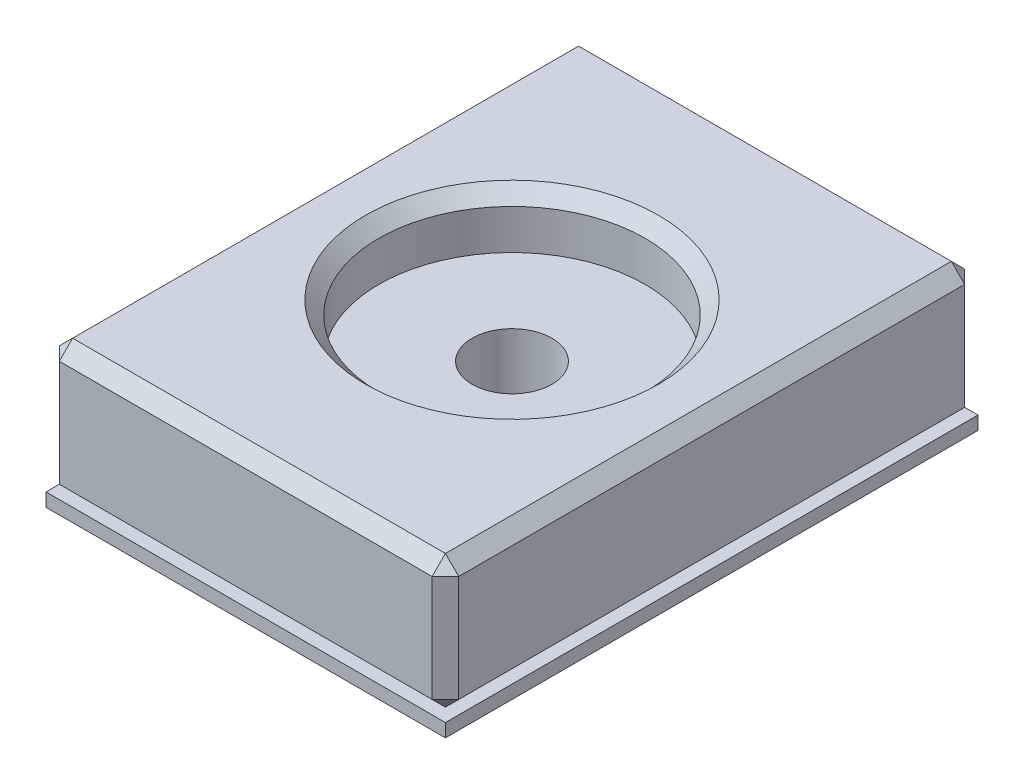
ISO-10303-21;
HEADER;
FILE_DESCRIPTION(('STEP AP214'),'2;1');
FILE_NAME('part.step','',(''),(''),'','','');
FILE_SCHEMA(('AUTOMOTIVE_DESIGN { 1 0 10303 214 1 1 1 1 }'));
ENDSEC;
DATA;
#1=APPLICATION_CONTEXT('core data for automotive mechanical design processes');
#2=APPLICATION_PROTOCOL_DEFINITION('international standard','automotive_design',2000,#1);
#3=PRODUCT_CONTEXT('',#1,'mechanical');
#4=PRODUCT('Part','Part','',(#3));
#5=PRODUCT_RELATED_PRODUCT_CATEGORY('part','',(#4));
#6=PRODUCT_DEFINITION_FORMATION('','',#4);
#7=PRODUCT_DEFINITION_CONTEXT('part definition',#1,'design');
#8=PRODUCT_DEFINITION('design','',#6,#7);
#9=PRODUCT_DEFINITION_SHAPE('','',#8);
#10=(LENGTH_UNIT() NAMED_UNIT(*) SI_UNIT(.MILLI.,.METRE.));
#11=(NAMED_UNIT(*) PLANE_ANGLE_UNIT() SI_UNIT($,.RADIAN.));
#12=(NAMED_UNIT(*) SI_UNIT($,.STERADIAN.) SOLID_ANGLE_UNIT());
#13=UNCERTAINTY_MEASURE_WITH_UNIT(LENGTH_MEASURE(1.E-05),#10,'distance_accuracy_value','');
#14=(GEOMETRIC_REPRESENTATION_CONTEXT(3) GLOBAL_UNCERTAINTY_ASSIGNED_CONTEXT((#13)) GLOBAL_UNIT_ASSIGNED_CONTEXT((#10,
#11,#12)) REPRESENTATION_CONTEXT('',''));
#15=CARTESIAN_POINT('',(0.,0.,0.));
#16=DIRECTION('',(0.,0.,1.));
#17=DIRECTION('',(1.,0.,0.));
#18=AXIS2_PLACEMENT_3D('',#15,#16,#17);
#19=CARTESIAN_POINT('',(0.,-3.,0.));
#20=DIRECTION('',(0.,-1.,0.));
#21=DIRECTION('',(0.,0.,-1.));
#22=AXIS2_PLACEMENT_3D('',#19,#20,#21);
#23=PLANE('',#22);
#24=DIRECTION('',(0.,0.,-1.));
#25=VECTOR('',#24,1.);
#26=CARTESIAN_POINT('',(-7.5,-3.,10.));
#27=LINE('',#26,#25);
#28=CARTESIAN_POINT('',(-7.5,-3.,10.));
#29=VERTEX_POINT('',#28);
#30=CARTESIAN_POINT('',(-7.5,-3.,-10.));
#31=VERTEX_POINT('',#30);
#32=EDGE_CURVE('E103',#29,#31,#27,.T.);
#33=ORIENTED_EDGE('',*,*,#32,.T.);
#34=DIRECTION('',(1.,0.,0.));
#35=VECTOR('',#34,1.);
#36=CARTESIAN_POINT('',(-7.5,-3.,-10.));
#37=LINE('',#36,#35);
#38=CARTESIAN_POINT('',(7.5,-3.,-10.));
#39=VERTEX_POINT('',#38);
#40=EDGE_CURVE('E98',#31,#39,#37,.T.);
#41=ORIENTED_EDGE('',*,*,#40,.T.);
#42=DIRECTION('',(0.,0.,1.));
#43=VECTOR('',#42,1.);
#44=CARTESIAN_POINT('',(7.5,-3.,-10.));
#45=LINE('',#44,#43);
#46=CARTESIAN_POINT('',(7.5,-3.,10.));
#47=VERTEX_POINT('',#46);
#48=EDGE_CURVE('E101',#39,#47,#45,.T.);
#49=ORIENTED_EDGE('',*,*,#48,.T.);
#50=DIRECTION('',(-1.,0.,0.));
#51=VECTOR('',#50,1.);
#52=CARTESIAN_POINT('',(7.5,-3.,10.));
#53=LINE('',#52,#51);
#54=EDGE_CURVE('E68',#47,#29,#53,.T.);
#55=ORIENTED_EDGE('',*,*,#54,.T.);
#56=EDGE_LOOP('',(#33,#41,#49,#55));
#57=FACE_BOUND('',#56,.T.);
#58=CARTESIAN_POINT('',(0.,-3.,0.));
#59=DIRECTION('',(0.,-1.,0.));
#60=DIRECTION('',(0.,0.,-1.));
#61=AXIS2_PLACEMENT_3D('',#58,#59,#60);
#62=CIRCLE('',#61,1.5);
#63=CARTESIAN_POINT('',(0.,-3.,-1.5));
#64=VERTEX_POINT('',#63);
#65=EDGE_CURVE('E118',#64,#64,#62,.T.);
#66=ORIENTED_EDGE('',*,*,#65,.F.);
#67=EDGE_LOOP('',(#66));
#68=FACE_BOUND('',#67,.T.);
#69=ADVANCED_FACE('F51',(#57,#68),#23,.T.);
#70=CARTESIAN_POINT('',(0.,-2.5,0.));
#71=DIRECTION('',(0.,-1.,0.));
#72=DIRECTION('',(0.,0.,-1.));
#73=AXIS2_PLACEMENT_3D('',#70,#71,#72);
#74=PLANE('',#73);
#75=DIRECTION('',(0.,0.,-1.));
#76=VECTOR('',#75,1.);
#77=CARTESIAN_POINT('',(-7.5,-2.5,10.));
#78=LINE('',#77,#76);
#79=CARTESIAN_POINT('',(-7.5,-2.5,10.));
#80=VERTEX_POINT('',#79);
#81=CARTESIAN_POINT('',(-7.5,-2.5,-10.));
#82=VERTEX_POINT('',#81);
#83=EDGE_CURVE('E115',#80,#82,#78,.T.);
#84=ORIENTED_EDGE('',*,*,#83,.F.);
#85=DIRECTION('',(-1.,0.,0.));
#86=VECTOR('',#85,1.);
#87=CARTESIAN_POINT('',(7.5,-2.5,10.));
#88=LINE('',#87,#86);
#89=CARTESIAN_POINT('',(7.5,-2.5,10.));
#90=VERTEX_POINT('',#89);
#91=EDGE_CURVE('E91',#90,#80,#88,.T.);
#92=ORIENTED_EDGE('',*,*,#91,.F.);
#93=DIRECTION('',(0.,0.,1.));
#94=VECTOR('',#93,1.);
#95=CARTESIAN_POINT('',(7.5,-2.5,-10.));
#96=LINE('',#95,#94);
#97=CARTESIAN_POINT('',(7.5,-2.5,-10.));
#98=VERTEX_POINT('',#97);
#99=EDGE_CURVE('E85',#98,#90,#96,.T.);
#100=ORIENTED_EDGE('',*,*,#99,.F.);
#101=DIRECTION('',(1.,0.,0.));
#102=VECTOR('',#101,1.);
#103=CARTESIAN_POINT('',(-7.5,-2.5,-10.));
#104=LINE('',#103,#102);
#105=EDGE_CURVE('E107',#82,#98,#104,.T.);
#106=ORIENTED_EDGE('',*,*,#105,.F.);
#107=EDGE_LOOP('',(#84,#92,#100,#106));
#108=FACE_BOUND('',#107,.T.);
#109=CARTESIAN_POINT('',(0.,-2.5,0.));
#110=DIRECTION('',(0.,-1.,0.));
#111=DIRECTION('',(0.,0.,-1.));
#112=AXIS2_PLACEMENT_3D('',#109,#110,#111);
#113=CIRCLE('',#112,1.5);
#114=CARTESIAN_POINT('',(0.,-2.5,-1.5));
#115=VERTEX_POINT('',#114);
#116=EDGE_CURVE('E130',#115,#115,#113,.T.);
#117=ORIENTED_EDGE('',*,*,#116,.T.);
#118=EDGE_LOOP('',(#117));
#119=FACE_BOUND('',#118,.T.);
#120=ADVANCED_FACE('F126',(#108,#119),#74,.F.);
#121=CARTESIAN_POINT('',(-7.5,-3.,10.));
#122=DIRECTION('',(1.,0.,0.));
#123=DIRECTION('',(0.,0.,-1.));
#124=AXIS2_PLACEMENT_3D('',#121,#122,#123);
#125=PLANE('',#124);
#126=ORIENTED_EDGE('',*,*,#83,.T.);
#127=DIRECTION('',(0.,1.,0.));
#128=VECTOR('',#127,1.);
#129=CARTESIAN_POINT('',(-7.5,-3.,-10.));
#130=LINE('',#129,#128);
#131=EDGE_CURVE('E13',#31,#82,#130,.T.);
#132=ORIENTED_EDGE('',*,*,#131,.F.);
#133=ORIENTED_EDGE('',*,*,#32,.F.);
#134=DIRECTION('',(0.,1.,0.));
#135=VECTOR('',#134,1.);
#136=CARTESIAN_POINT('',(-7.5,-3.,10.));
#137=LINE('',#136,#135);
#138=EDGE_CURVE('E111',#29,#80,#137,.T.);
#139=ORIENTED_EDGE('',*,*,#138,.T.);
#140=EDGE_LOOP('',(#126,#132,#133,#139));
#141=FACE_BOUND('',#140,.T.);
#142=ADVANCED_FACE('F53',(#141),#125,.F.);
#143=CARTESIAN_POINT('',(-7.5,-3.,-10.));
#144=DIRECTION('',(0.,0.,1.));
#145=DIRECTION('',(1.,0.,0.));
#146=AXIS2_PLACEMENT_3D('',#143,#144,#145);
#147=PLANE('',#146);
#148=ORIENTED_EDGE('',*,*,#105,.T.);
#149=DIRECTION('',(0.,1.,0.));
#150=VECTOR('',#149,1.);
#151=CARTESIAN_POINT('',(7.5,-3.,-10.));
#152=LINE('',#151,#150);
#153=EDGE_CURVE('E60',#39,#98,#152,.T.);
#154=ORIENTED_EDGE('',*,*,#153,.F.);
#155=ORIENTED_EDGE('',*,*,#40,.F.);
#156=ORIENTED_EDGE('',*,*,#131,.T.);
#157=EDGE_LOOP('',(#148,#154,#155,#156));
#158=FACE_BOUND('',#157,.T.);
#159=ADVANCED_FACE('F106',(#158),#147,.F.);
#160=CARTESIAN_POINT('',(7.5,-3.,-10.));
#161=DIRECTION('',(-1.,0.,0.));
#162=DIRECTION('',(0.,0.,1.));
#163=AXIS2_PLACEMENT_3D('',#160,#161,#162);
#164=PLANE('',#163);
#165=ORIENTED_EDGE('',*,*,#99,.T.);
#166=DIRECTION('',(0.,1.,0.));
#167=VECTOR('',#166,1.);
#168=CARTESIAN_POINT('',(7.5,-3.,10.));
#169=LINE('',#168,#167);
#170=EDGE_CURVE('E108',#47,#90,#169,.T.);
#171=ORIENTED_EDGE('',*,*,#170,.F.);
#172=ORIENTED_EDGE('',*,*,#48,.F.);
#173=ORIENTED_EDGE('',*,*,#153,.T.);
#174=EDGE_LOOP('',(#165,#171,#172,#173));
#175=FACE_BOUND('',#174,.T.);
#176=ADVANCED_FACE('F109',(#175),#164,.F.);
#177=CARTESIAN_POINT('',(7.5,-3.,10.));
#178=DIRECTION('',(0.,0.,-1.));
#179=DIRECTION('',(-1.,0.,0.));
#180=AXIS2_PLACEMENT_3D('',#177,#178,#179);
#181=PLANE('',#180);
#182=ORIENTED_EDGE('',*,*,#91,.T.);
#183=ORIENTED_EDGE('',*,*,#138,.F.);
#184=ORIENTED_EDGE('',*,*,#54,.F.);
#185=ORIENTED_EDGE('',*,*,#170,.T.);
#186=EDGE_LOOP('',(#182,#183,#184,#185));
#187=FACE_BOUND('',#186,.T.);
#188=ADVANCED_FACE('F123',(#187),#181,.F.);
#189=CARTESIAN_POINT('',(0.,-3.,0.));
#190=DIRECTION('',(0.,1.,0.));
#191=DIRECTION('',(0.,0.,1.));
#192=AXIS2_PLACEMENT_3D('',#189,#190,#191);
#193=CYLINDRICAL_SURFACE('',#192,1.5);
#194=ORIENTED_EDGE('',*,*,#65,.T.);
#195=EDGE_LOOP('',(#194));
#196=FACE_BOUND('',#195,.T.);
#197=ORIENTED_EDGE('',*,*,#116,.F.);
#198=EDGE_LOOP('',(#197));
#199=FACE_BOUND('',#198,.T.);
#200=ADVANCED_FACE('F136',(#196,#199),#193,.F.);
#201=CLOSED_SHELL('',(#69,#120,#142,#159,#176,#188,#200));
#202=MANIFOLD_SOLID_BREP('B2',#201);
#203=CARTESIAN_POINT('',(0.,-2.5,0.));
#204=DIRECTION('',(0.,1.,0.));
#205=DIRECTION('',(0.,0.,1.));
#206=AXIS2_PLACEMENT_3D('',#203,#204,#205);
#207=CYLINDRICAL_SURFACE('',#206,1.5);
#208=CARTESIAN_POINT('',(0.,-2.5,0.));
#209=DIRECTION('',(0.,1.,0.));
#210=DIRECTION('',(0.,0.,1.));
#211=AXIS2_PLACEMENT_3D('',#208,#209,#210);
#212=CIRCLE('',#211,1.5);
#213=CARTESIAN_POINT('',(0.,-2.5,1.5));
#214=VERTEX_POINT('',#213);
#215=EDGE_CURVE('E323',#214,#214,#212,.T.);
#216=ORIENTED_EDGE('',*,*,#215,.F.);
#217=EDGE_LOOP('',(#216));
#218=FACE_BOUND('',#217,.T.);
#219=CARTESIAN_POINT('',(0.,0.500000000000002,0.));
#220=DIRECTION('',(0.,1.,0.));
#221=DIRECTION('',(0.,0.,1.));
#222=AXIS2_PLACEMENT_3D('',#219,#220,#221);
#223=CIRCLE('',#222,1.5);
#224=CARTESIAN_POINT('',(0.,0.500000000000002,1.5));
#225=VERTEX_POINT('',#224);
#226=EDGE_CURVE('E326',#225,#225,#223,.F.);
#227=ORIENTED_EDGE('',*,*,#226,.F.);
#228=EDGE_LOOP('',(#227));
#229=FACE_BOUND('',#228,.T.);
#230=ADVANCED_FACE('F195',(#218,#229),#207,.F.);
#231=CARTESIAN_POINT('',(7.5,-2.5,10.));
#232=DIRECTION('',(-1.,0.,0.));
#233=DIRECTION('',(0.,0.,1.));
#234=AXIS2_PLACEMENT_3D('',#231,#232,#233);
#235=PLANE('',#234);
#236=DIRECTION('',(0.,-1.,0.));
#237=VECTOR('',#236,1.);
#238=CARTESIAN_POINT('',(7.5,-2.5,9.5));
#239=LINE('',#238,#237);
#240=CARTESIAN_POINT('',(7.5,2.,9.5));
#241=VERTEX_POINT('',#240);
#242=CARTESIAN_POINT('',(7.5,-2.,9.5));
#243=VERTEX_POINT('',#242);
#244=EDGE_CURVE('E353',#241,#243,#239,.T.);
#245=ORIENTED_EDGE('',*,*,#244,.T.);
#246=DIRECTION('',(0.,0.,-1.));
#247=VECTOR('',#246,1.);
#248=CARTESIAN_POINT('',(7.5,-2.,10.));
#249=LINE('',#248,#247);
#250=CARTESIAN_POINT('',(7.5,-2.,-9.5));
#251=VERTEX_POINT('',#250);
#252=EDGE_CURVE('E304',#243,#251,#249,.T.);
#253=ORIENTED_EDGE('',*,*,#252,.T.);
#254=DIRECTION('',(0.,1.,0.));
#255=VECTOR('',#254,1.);
#256=CARTESIAN_POINT('',(7.5,2.5,-9.5));
#257=LINE('',#256,#255);
#258=CARTESIAN_POINT('',(7.5,2.,-9.5));
#259=VERTEX_POINT('',#258);
#260=EDGE_CURVE('E355',#251,#259,#257,.T.);
#261=ORIENTED_EDGE('',*,*,#260,.T.);
#262=DIRECTION('',(0.,0.,1.));
#263=VECTOR('',#262,1.);
#264=CARTESIAN_POINT('',(7.5,2.,10.));
#265=LINE('',#264,#263);
#266=EDGE_CURVE('E351',#259,#241,#265,.T.);
#267=ORIENTED_EDGE('',*,*,#266,.T.);
#268=EDGE_LOOP('',(#245,#253,#261,#267));
#269=FACE_BOUND('',#268,.T.);
#270=ADVANCED_FACE('F444',(#269),#235,.F.);
#271=CARTESIAN_POINT('',(-7.5,2.5,10.));
#272=DIRECTION('',(0.,-1.,0.));
#273=DIRECTION('',(0.,0.,-1.));
#274=AXIS2_PLACEMENT_3D('',#271,#272,#273);
#275=PLANE('',#274);
#276=DIRECTION('',(1.,0.,0.));
#277=VECTOR('',#276,1.);
#278=CARTESIAN_POINT('',(-7.5,2.5,9.5));
#279=LINE('',#278,#277);
#280=CARTESIAN_POINT('',(-7.,2.5,9.5));
#281=VERTEX_POINT('',#280);
#282=CARTESIAN_POINT('',(7.,2.5,9.5));
#283=VERTEX_POINT('',#282);
#284=EDGE_CURVE('E212',#281,#283,#279,.T.);
#285=ORIENTED_EDGE('',*,*,#284,.T.);
#286=DIRECTION('',(0.,0.,-1.));
#287=VECTOR('',#286,1.);
#288=CARTESIAN_POINT('',(7.,2.5,10.));
#289=LINE('',#288,#287);
#290=CARTESIAN_POINT('',(7.,2.5,-9.5));
#291=VERTEX_POINT('',#290);
#292=EDGE_CURVE('E204',#283,#291,#289,.T.);
#293=ORIENTED_EDGE('',*,*,#292,.T.);
#294=DIRECTION('',(-1.,0.,0.));
#295=VECTOR('',#294,1.);
#296=CARTESIAN_POINT('',(-7.5,2.5,-9.5));
#297=LINE('',#296,#295);
#298=CARTESIAN_POINT('',(-7.,2.5,-9.5));
#299=VERTEX_POINT('',#298);
#300=EDGE_CURVE('E370',#291,#299,#297,.T.);
#301=ORIENTED_EDGE('',*,*,#300,.T.);
#302=DIRECTION('',(0.,0.,1.));
#303=VECTOR('',#302,1.);
#304=CARTESIAN_POINT('',(-7.,2.5,10.));
#305=LINE('',#304,#303);
#306=EDGE_CURVE('E217',#299,#281,#305,.T.);
#307=ORIENTED_EDGE('',*,*,#306,.T.);
#308=EDGE_LOOP('',(#285,#293,#301,#307));
#309=FACE_BOUND('',#308,.T.);
#310=CARTESIAN_POINT('',(0.,2.5,0.));
#311=DIRECTION('',(0.,-1.,0.));
#312=DIRECTION('',(0.,0.,-1.));
#313=AXIS2_PLACEMENT_3D('',#310,#311,#312);
#314=CIRCLE('',#313,5.5);
#315=CARTESIAN_POINT('',(0.,2.5,-5.5));
#316=VERTEX_POINT('',#315);
#317=EDGE_CURVE('E367',#316,#316,#314,.T.);
#318=ORIENTED_EDGE('',*,*,#317,.T.);
#319=EDGE_LOOP('',(#318));
#320=FACE_BOUND('',#319,.T.);
#321=ADVANCED_FACE('F450',(#309,#320),#275,.F.);
#322=CARTESIAN_POINT('',(-7.5,-2.5,10.));
#323=DIRECTION('',(1.,0.,0.));
#324=DIRECTION('',(0.,0.,-1.));
#325=AXIS2_PLACEMENT_3D('',#322,#323,#324);
#326=PLANE('',#325);
#327=DIRECTION('',(0.,-1.,0.));
#328=VECTOR('',#327,1.);
#329=CARTESIAN_POINT('',(-7.5,-2.5,-9.5));
#330=LINE('',#329,#328);
#331=CARTESIAN_POINT('',(-7.5,2.,-9.5));
#332=VERTEX_POINT('',#331);
#333=CARTESIAN_POINT('',(-7.5,-2.,-9.5));
#334=VERTEX_POINT('',#333);
#335=EDGE_CURVE('E337',#332,#334,#330,.T.);
#336=ORIENTED_EDGE('',*,*,#335,.T.);
#337=DIRECTION('',(0.,0.,1.));
#338=VECTOR('',#337,1.);
#339=CARTESIAN_POINT('',(-7.5,-2.,10.));
#340=LINE('',#339,#338);
#341=CARTESIAN_POINT('',(-7.5,-2.,9.5));
#342=VERTEX_POINT('',#341);
#343=EDGE_CURVE('E339',#334,#342,#340,.T.);
#344=ORIENTED_EDGE('',*,*,#343,.T.);
#345=DIRECTION('',(0.,1.,0.));
#346=VECTOR('',#345,1.);
#347=CARTESIAN_POINT('',(-7.5,-2.5,9.5));
#348=LINE('',#347,#346);
#349=CARTESIAN_POINT('',(-7.5,2.,9.5));
#350=VERTEX_POINT('',#349);
#351=EDGE_CURVE('E335',#342,#350,#348,.T.);
#352=ORIENTED_EDGE('',*,*,#351,.T.);
#353=DIRECTION('',(0.,0.,-1.));
#354=VECTOR('',#353,1.);
#355=CARTESIAN_POINT('',(-7.5,2.,10.));
#356=LINE('',#355,#354);
#357=EDGE_CURVE('E333',#350,#332,#356,.T.);
#358=ORIENTED_EDGE('',*,*,#357,.T.);
#359=EDGE_LOOP('',(#336,#344,#352,#358));
#360=FACE_BOUND('',#359,.T.);
#361=ADVANCED_FACE('F468',(#360),#326,.F.);
#362=CARTESIAN_POINT('',(-7.5,-2.5,10.));
#363=DIRECTION('',(0.,1.,0.));
#364=DIRECTION('',(0.,0.,1.));
#365=AXIS2_PLACEMENT_3D('',#362,#363,#364);
#366=PLANE('',#365);
#367=DIRECTION('',(-1.,0.,0.));
#368=VECTOR('',#367,1.);
#369=CARTESIAN_POINT('',(-7.5,-2.5,9.5));
#370=LINE('',#369,#368);
#371=CARTESIAN_POINT('',(7.,-2.5,9.5));
#372=VERTEX_POINT('',#371);
#373=CARTESIAN_POINT('',(-7.,-2.5,9.5));
#374=VERTEX_POINT('',#373);
#375=EDGE_CURVE('E290',#372,#374,#370,.T.);
#376=ORIENTED_EDGE('',*,*,#375,.T.);
#377=DIRECTION('',(0.,0.,-1.));
#378=VECTOR('',#377,1.);
#379=CARTESIAN_POINT('',(-7.,-2.5,10.));
#380=LINE('',#379,#378);
#381=CARTESIAN_POINT('',(-7.,-2.5,-9.5));
#382=VERTEX_POINT('',#381);
#383=EDGE_CURVE('E331',#374,#382,#380,.T.);
#384=ORIENTED_EDGE('',*,*,#383,.T.);
#385=DIRECTION('',(1.,0.,0.));
#386=VECTOR('',#385,1.);
#387=CARTESIAN_POINT('',(7.5,-2.5,-9.5));
#388=LINE('',#387,#386);
#389=CARTESIAN_POINT('',(7.,-2.5,-9.5));
#390=VERTEX_POINT('',#389);
#391=EDGE_CURVE('E293',#382,#390,#388,.T.);
#392=ORIENTED_EDGE('',*,*,#391,.T.);
#393=DIRECTION('',(0.,0.,1.));
#394=VECTOR('',#393,1.);
#395=CARTESIAN_POINT('',(7.,-2.5,10.));
#396=LINE('',#395,#394);
#397=EDGE_CURVE('E284',#390,#372,#396,.T.);
#398=ORIENTED_EDGE('',*,*,#397,.T.);
#399=EDGE_LOOP('',(#376,#384,#392,#398));
#400=FACE_BOUND('',#399,.T.);
#401=ORIENTED_EDGE('',*,*,#215,.T.);
#402=EDGE_LOOP('',(#401));
#403=FACE_BOUND('',#402,.T.);
#404=ADVANCED_FACE('F286',(#400,#403),#366,.F.);
#405=CARTESIAN_POINT('',(0.,0.,10.));
#406=DIRECTION('',(0.,0.,-1.));
#407=DIRECTION('',(-1.,0.,0.));
#408=AXIS2_PLACEMENT_3D('',#405,#406,#407);
#409=PLANE('',#408);
#410=DIRECTION('',(0.,-1.,0.));
#411=VECTOR('',#410,1.);
#412=CARTESIAN_POINT('',(-7.,0.,10.));
#413=LINE('',#412,#411);
#414=CARTESIAN_POINT('',(-7.,2.,10.));
#415=VERTEX_POINT('',#414);
#416=CARTESIAN_POINT('',(-7.,-2.,10.));
#417=VERTEX_POINT('',#416);
#418=EDGE_CURVE('E362',#415,#417,#413,.T.);
#419=ORIENTED_EDGE('',*,*,#418,.T.);
#420=DIRECTION('',(1.,0.,0.));
#421=VECTOR('',#420,1.);
#422=CARTESIAN_POINT('',(0.,-2.,10.));
#423=LINE('',#422,#421);
#424=CARTESIAN_POINT('',(7.,-2.,10.));
#425=VERTEX_POINT('',#424);
#426=EDGE_CURVE('E364',#417,#425,#423,.T.);
#427=ORIENTED_EDGE('',*,*,#426,.T.);
#428=DIRECTION('',(0.,1.,0.));
#429=VECTOR('',#428,1.);
#430=CARTESIAN_POINT('',(7.,0.,10.));
#431=LINE('',#430,#429);
#432=CARTESIAN_POINT('',(7.,2.,10.));
#433=VERTEX_POINT('',#432);
#434=EDGE_CURVE('E360',#425,#433,#431,.T.);
#435=ORIENTED_EDGE('',*,*,#434,.T.);
#436=DIRECTION('',(-1.,0.,0.));
#437=VECTOR('',#436,1.);
#438=CARTESIAN_POINT('',(0.,2.,10.));
#439=LINE('',#438,#437);
#440=EDGE_CURVE('E358',#433,#415,#439,.T.);
#441=ORIENTED_EDGE('',*,*,#440,.T.);
#442=EDGE_LOOP('',(#419,#427,#435,#441));
#443=FACE_BOUND('',#442,.T.);
#444=ADVANCED_FACE('F458',(#443),#409,.F.);
#445=CARTESIAN_POINT('',(0.,0.,-10.));
#446=DIRECTION('',(0.,0.,-1.));
#447=DIRECTION('',(-1.,0.,0.));
#448=AXIS2_PLACEMENT_3D('',#445,#446,#447);
#449=PLANE('',#448);
#450=DIRECTION('',(-1.,0.,0.));
#451=VECTOR('',#450,1.);
#452=CARTESIAN_POINT('',(-7.5,-2.,-10.));
#453=LINE('',#452,#451);
#454=CARTESIAN_POINT('',(7.,-2.,-10.));
#455=VERTEX_POINT('',#454);
#456=CARTESIAN_POINT('',(-7.,-2.,-10.));
#457=VERTEX_POINT('',#456);
#458=EDGE_CURVE('E346',#455,#457,#453,.T.);
#459=ORIENTED_EDGE('',*,*,#458,.T.);
#460=DIRECTION('',(0.,1.,0.));
#461=VECTOR('',#460,1.);
#462=CARTESIAN_POINT('',(-7.,2.5,-10.));
#463=LINE('',#462,#461);
#464=CARTESIAN_POINT('',(-7.,2.,-10.));
#465=VERTEX_POINT('',#464);
#466=EDGE_CURVE('E348',#457,#465,#463,.T.);
#467=ORIENTED_EDGE('',*,*,#466,.T.);
#468=DIRECTION('',(1.,0.,0.));
#469=VECTOR('',#468,1.);
#470=CARTESIAN_POINT('',(7.5,2.,-10.));
#471=LINE('',#470,#469);
#472=CARTESIAN_POINT('',(7.,2.,-10.));
#473=VERTEX_POINT('',#472);
#474=EDGE_CURVE('E342',#465,#473,#471,.T.);
#475=ORIENTED_EDGE('',*,*,#474,.T.);
#476=DIRECTION('',(0.,-1.,0.));
#477=VECTOR('',#476,1.);
#478=CARTESIAN_POINT('',(7.,-2.5,-10.));
#479=LINE('',#478,#477);
#480=EDGE_CURVE('E344',#473,#455,#479,.T.);
#481=ORIENTED_EDGE('',*,*,#480,.T.);
#482=EDGE_LOOP('',(#459,#467,#475,#481));
#483=FACE_BOUND('',#482,.T.);
#484=ADVANCED_FACE('F461',(#483),#449,.T.);
#485=CARTESIAN_POINT('',(0.,0.500000000000002,0.));
#486=DIRECTION('',(0.,1.,0.));
#487=DIRECTION('',(0.,0.,1.));
#488=AXIS2_PLACEMENT_3D('',#485,#486,#487);
#489=PLANE('',#488);
#490=CARTESIAN_POINT('',(0.,0.500000000000002,0.));
#491=DIRECTION('',(0.,1.,0.));
#492=DIRECTION('',(0.,0.,1.));
#493=AXIS2_PLACEMENT_3D('',#490,#491,#492);
#494=CIRCLE('',#493,5.);
#495=CARTESIAN_POINT('',(0.,0.500000000000002,5.));
#496=VERTEX_POINT('',#495);
#497=EDGE_CURVE('E429',#496,#496,#494,.T.);
#498=ORIENTED_EDGE('',*,*,#497,.T.);
#499=EDGE_LOOP('',(#498));
#500=FACE_BOUND('',#499,.T.);
#501=ORIENTED_EDGE('',*,*,#226,.T.);
#502=EDGE_LOOP('',(#501));
#503=FACE_BOUND('',#502,.T.);
#504=ADVANCED_FACE('F441',(#500,#503),#489,.T.);
#505=CARTESIAN_POINT('',(0.,0.500000000000002,0.));
#506=DIRECTION('',(0.,1.,0.));
#507=DIRECTION('',(0.,0.,1.));
#508=AXIS2_PLACEMENT_3D('',#505,#506,#507);
#509=CYLINDRICAL_SURFACE('',#508,5.);
#510=CARTESIAN_POINT('',(0.,2.,0.));
#511=DIRECTION('',(0.,-1.,0.));
#512=DIRECTION('',(0.,0.,-1.));
#513=AXIS2_PLACEMENT_3D('',#510,#511,#512);
#514=CIRCLE('',#513,5.);
#515=CARTESIAN_POINT('',(0.,2.,-5.));
#516=VERTEX_POINT('',#515);
#517=EDGE_CURVE('E49',#516,#516,#514,.F.);
#518=ORIENTED_EDGE('',*,*,#517,.T.);
#519=EDGE_LOOP('',(#518));
#520=FACE_BOUND('',#519,.T.);
#521=ORIENTED_EDGE('',*,*,#497,.F.);
#522=EDGE_LOOP('',(#521));
#523=FACE_BOUND('',#522,.T.);
#524=ADVANCED_FACE('F456',(#520,#523),#509,.F.);
#525=CARTESIAN_POINT('',(7.,2.5,10.));
#526=DIRECTION('',(-0.707106781186547,-0.707106781186547,0.));
#527=DIRECTION('',(0.,0.,-1.));
#528=AXIS2_PLACEMENT_3D('',#525,#526,#527);
#529=PLANE('',#528);
#530=DIRECTION('',(0.707106781186547,-0.707106781186547,0.));
#531=VECTOR('',#530,1.);
#532=CARTESIAN_POINT('',(7.25,2.25,9.5));
#533=LINE('',#532,#531);
#534=EDGE_CURVE('E199',#241,#283,#533,.F.);
#535=ORIENTED_EDGE('',*,*,#534,.F.);
#536=ORIENTED_EDGE('',*,*,#266,.F.);
#537=DIRECTION('',(-0.707106781186547,0.707106781186547,0.));
#538=VECTOR('',#537,1.);
#539=CARTESIAN_POINT('',(7.5,2.,-9.5));
#540=LINE('',#539,#538);
#541=EDGE_CURVE('E422',#291,#259,#540,.F.);
#542=ORIENTED_EDGE('',*,*,#541,.F.);
#543=ORIENTED_EDGE('',*,*,#292,.F.);
#544=EDGE_LOOP('',(#535,#536,#542,#543));
#545=FACE_BOUND('',#544,.T.);
#546=ADVANCED_FACE('F541',(#545),#529,.F.);
#547=CARTESIAN_POINT('',(7.,2.,10.));
#548=DIRECTION('',(0.577350269189626,0.577350269189626,0.577350269189626));
#549=DIRECTION('',(0.707106781186547,0.,-0.707106781186547));
#550=AXIS2_PLACEMENT_3D('',#547,#548,#549);
#551=PLANE('',#550);
#552=DIRECTION('',(-0.707106781186547,0.,0.707106781186547));
#553=VECTOR('',#552,1.);
#554=CARTESIAN_POINT('',(7.,2.,10.));
#555=LINE('',#554,#553);
#556=EDGE_CURVE('E417',#241,#433,#555,.T.);
#557=ORIENTED_EDGE('',*,*,#556,.F.);
#558=ORIENTED_EDGE('',*,*,#534,.T.);
#559=DIRECTION('',(0.,0.707106781186547,-0.707106781186547));
#560=VECTOR('',#559,1.);
#561=CARTESIAN_POINT('',(7.,2.,10.));
#562=LINE('',#561,#560);
#563=EDGE_CURVE('E420',#433,#283,#562,.T.);
#564=ORIENTED_EDGE('',*,*,#563,.F.);
#565=EDGE_LOOP('',(#557,#558,#564));
#566=FACE_BOUND('',#565,.T.);
#567=ADVANCED_FACE('F539',(#566),#551,.T.);
#568=CARTESIAN_POINT('',(7.5,2.,-9.5));
#569=DIRECTION('',(0.577350269189626,0.577350269189626,-0.577350269189626));
#570=DIRECTION('',(-0.707106781186547,0.,-0.707106781186547));
#571=AXIS2_PLACEMENT_3D('',#568,#569,#570);
#572=PLANE('',#571);
#573=DIRECTION('',(0.,0.707106781186547,0.707106781186547));
#574=VECTOR('',#573,1.);
#575=CARTESIAN_POINT('',(7.,2.25,-9.75));
#576=LINE('',#575,#574);
#577=EDGE_CURVE('E411',#291,#473,#576,.F.);
#578=ORIENTED_EDGE('',*,*,#577,.F.);
#579=ORIENTED_EDGE('',*,*,#541,.T.);
#580=DIRECTION('',(-0.707106781186547,0.,-0.707106781186547));
#581=VECTOR('',#580,1.);
#582=CARTESIAN_POINT('',(7.5,2.,-9.5));
#583=LINE('',#582,#581);
#584=EDGE_CURVE('E414',#473,#259,#583,.F.);
#585=ORIENTED_EDGE('',*,*,#584,.F.);
#586=EDGE_LOOP('',(#578,#579,#585));
#587=FACE_BOUND('',#586,.T.);
#588=ADVANCED_FACE('F535',(#587),#572,.T.);
#589=CARTESIAN_POINT('',(0.,2.,10.));
#590=DIRECTION('',(0.,-0.707106781186547,-0.707106781186547));
#591=DIRECTION('',(-1.,0.,0.));
#592=AXIS2_PLACEMENT_3D('',#589,#590,#591);
#593=PLANE('',#592);
#594=ORIENTED_EDGE('',*,*,#563,.T.);
#595=ORIENTED_EDGE('',*,*,#284,.F.);
#596=DIRECTION('',(0.,-0.707106781186547,0.707106781186547));
#597=VECTOR('',#596,1.);
#598=CARTESIAN_POINT('',(-7.,2.25,9.75));
#599=LINE('',#598,#597);
#600=EDGE_CURVE('E405',#415,#281,#599,.F.);
#601=ORIENTED_EDGE('',*,*,#600,.F.);
#602=ORIENTED_EDGE('',*,*,#440,.F.);
#603=EDGE_LOOP('',(#594,#595,#601,#602));
#604=FACE_BOUND('',#603,.T.);
#605=ADVANCED_FACE('F531',(#604),#593,.F.);
#606=CARTESIAN_POINT('',(7.,0.,10.));
#607=DIRECTION('',(-0.707106781186547,0.,-0.707106781186547));
#608=DIRECTION('',(0.,1.,0.));
#609=AXIS2_PLACEMENT_3D('',#606,#607,#608);
#610=PLANE('',#609);
#611=ORIENTED_EDGE('',*,*,#556,.T.);
#612=ORIENTED_EDGE('',*,*,#434,.F.);
#613=DIRECTION('',(0.707106781186547,0.,-0.707106781186547));
#614=VECTOR('',#613,1.);
#615=CARTESIAN_POINT('',(7.25,-2.,9.75));
#616=LINE('',#615,#614);
#617=EDGE_CURVE('E308',#243,#425,#616,.F.);
#618=ORIENTED_EDGE('',*,*,#617,.F.);
#619=ORIENTED_EDGE('',*,*,#244,.F.);
#620=EDGE_LOOP('',(#611,#612,#618,#619));
#621=FACE_BOUND('',#620,.T.);
#622=ADVANCED_FACE('F528',(#621),#610,.F.);
#623=CARTESIAN_POINT('',(7.5,-2.,10.));
#624=DIRECTION('',(-0.707106781186547,0.707106781186547,0.));
#625=DIRECTION('',(0.,0.,-1.));
#626=AXIS2_PLACEMENT_3D('',#623,#624,#625);
#627=PLANE('',#626);
#628=DIRECTION('',(0.707106781186547,0.707106781186547,0.));
#629=VECTOR('',#628,1.);
#630=CARTESIAN_POINT('',(7.,-2.5,-9.5));
#631=LINE('',#630,#629);
#632=EDGE_CURVE('E309',#251,#390,#631,.F.);
#633=ORIENTED_EDGE('',*,*,#632,.F.);
#634=ORIENTED_EDGE('',*,*,#252,.F.);
#635=DIRECTION('',(-0.707106781186547,-0.707106781186547,0.));
#636=VECTOR('',#635,1.);
#637=CARTESIAN_POINT('',(7.,-2.5,9.5));
#638=LINE('',#637,#636);
#639=EDGE_CURVE('E300',#372,#243,#638,.F.);
#640=ORIENTED_EDGE('',*,*,#639,.F.);
#641=ORIENTED_EDGE('',*,*,#397,.F.);
#642=EDGE_LOOP('',(#633,#634,#640,#641));
#643=FACE_BOUND('',#642,.T.);
#644=ADVANCED_FACE('F302',(#643),#627,.F.);
#645=CARTESIAN_POINT('',(7.5,-2.5,-9.5));
#646=DIRECTION('',(0.707106781186547,0.,-0.707106781186547));
#647=DIRECTION('',(0.,-1.,0.));
#648=AXIS2_PLACEMENT_3D('',#645,#646,#647);
#649=PLANE('',#648);
#650=ORIENTED_EDGE('',*,*,#584,.T.);
#651=ORIENTED_EDGE('',*,*,#260,.F.);
#652=DIRECTION('',(0.707106781186547,0.,0.707106781186547));
#653=VECTOR('',#652,1.);
#654=CARTESIAN_POINT('',(7.25,-2.,-9.75));
#655=LINE('',#654,#653);
#656=EDGE_CURVE('E401',#455,#251,#655,.T.);
#657=ORIENTED_EDGE('',*,*,#656,.F.);
#658=ORIENTED_EDGE('',*,*,#480,.F.);
#659=EDGE_LOOP('',(#650,#651,#657,#658));
#660=FACE_BOUND('',#659,.T.);
#661=ADVANCED_FACE('F521',(#660),#649,.T.);
#662=CARTESIAN_POINT('',(-7.5,2.5,-9.5));
#663=DIRECTION('',(0.,0.707106781186547,-0.707106781186547));
#664=DIRECTION('',(1.,0.,0.));
#665=AXIS2_PLACEMENT_3D('',#662,#663,#664);
#666=PLANE('',#665);
#667=ORIENTED_EDGE('',*,*,#577,.T.);
#668=ORIENTED_EDGE('',*,*,#474,.F.);
#669=DIRECTION('',(0.,-0.707106781186547,-0.707106781186547));
#670=VECTOR('',#669,1.);
#671=CARTESIAN_POINT('',(-7.,2.,-10.));
#672=LINE('',#671,#670);
#673=EDGE_CURVE('E398',#299,#465,#672,.T.);
#674=ORIENTED_EDGE('',*,*,#673,.F.);
#675=ORIENTED_EDGE('',*,*,#300,.F.);
#676=EDGE_LOOP('',(#667,#668,#674,#675));
#677=FACE_BOUND('',#676,.T.);
#678=ADVANCED_FACE('F517',(#677),#666,.T.);
#679=CARTESIAN_POINT('',(-7.5,2.,10.));
#680=DIRECTION('',(0.707106781186547,-0.707106781186547,0.));
#681=DIRECTION('',(0.,0.,-1.));
#682=AXIS2_PLACEMENT_3D('',#679,#680,#681);
#683=PLANE('',#682);
#684=DIRECTION('',(0.707106781186547,0.707106781186547,0.));
#685=VECTOR('',#684,1.);
#686=CARTESIAN_POINT('',(-7.5,2.,9.5));
#687=LINE('',#686,#685);
#688=EDGE_CURVE('E408',#281,#350,#687,.F.);
#689=ORIENTED_EDGE('',*,*,#688,.F.);
#690=ORIENTED_EDGE('',*,*,#306,.F.);
#691=DIRECTION('',(-0.707106781186547,-0.707106781186547,0.));
#692=VECTOR('',#691,1.);
#693=CARTESIAN_POINT('',(-7.25,2.25,-9.5));
#694=LINE('',#693,#692);
#695=EDGE_CURVE('E395',#332,#299,#694,.F.);
#696=ORIENTED_EDGE('',*,*,#695,.F.);
#697=ORIENTED_EDGE('',*,*,#357,.F.);
#698=EDGE_LOOP('',(#689,#690,#696,#697));
#699=FACE_BOUND('',#698,.T.);
#700=ADVANCED_FACE('F513',(#699),#683,.F.);
#701=CARTESIAN_POINT('',(-7.5,2.,9.5));
#702=DIRECTION('',(-0.577350269189626,0.577350269189626,0.577350269189626));
#703=DIRECTION('',(0.707106781186547,0.,0.707106781186547));
#704=AXIS2_PLACEMENT_3D('',#701,#702,#703);
#705=PLANE('',#704);
#706=ORIENTED_EDGE('',*,*,#600,.T.);
#707=ORIENTED_EDGE('',*,*,#688,.T.);
#708=DIRECTION('',(-0.707106781186547,0.,-0.707106781186547));
#709=VECTOR('',#708,1.);
#710=CARTESIAN_POINT('',(-7.5,2.,9.5));
#711=LINE('',#710,#709);
#712=EDGE_CURVE('E316',#415,#350,#711,.T.);
#713=ORIENTED_EDGE('',*,*,#712,.F.);
#714=EDGE_LOOP('',(#706,#707,#713));
#715=FACE_BOUND('',#714,.T.);
#716=ADVANCED_FACE('F510',(#715),#705,.T.);
#717=CARTESIAN_POINT('',(7.,-2.5,9.5));
#718=DIRECTION('',(0.577350269189626,-0.577350269189626,0.577350269189626));
#719=DIRECTION('',(0.707106781186547,0.,-0.707106781186547));
#720=AXIS2_PLACEMENT_3D('',#717,#718,#719);
#721=PLANE('',#720);
#722=ORIENTED_EDGE('',*,*,#639,.T.);
#723=ORIENTED_EDGE('',*,*,#617,.T.);
#724=DIRECTION('',(0.,0.707106781186547,0.707106781186547));
#725=VECTOR('',#724,1.);
#726=CARTESIAN_POINT('',(7.,-2.5,9.5));
#727=LINE('',#726,#725);
#728=EDGE_CURVE('E311',#372,#425,#727,.T.);
#729=ORIENTED_EDGE('',*,*,#728,.F.);
#730=EDGE_LOOP('',(#722,#723,#729));
#731=FACE_BOUND('',#730,.T.);
#732=ADVANCED_FACE('F312',(#731),#721,.T.);
#733=CARTESIAN_POINT('',(7.,-2.5,-9.5));
#734=DIRECTION('',(0.577350269189626,-0.577350269189626,-0.577350269189626));
#735=DIRECTION('',(-0.707106781186547,0.,-0.707106781186547));
#736=AXIS2_PLACEMENT_3D('',#733,#734,#735);
#737=PLANE('',#736);
#738=ORIENTED_EDGE('',*,*,#656,.T.);
#739=ORIENTED_EDGE('',*,*,#632,.T.);
#740=DIRECTION('',(0.,0.707106781186547,-0.707106781186547));
#741=VECTOR('',#740,1.);
#742=CARTESIAN_POINT('',(7.,-2.5,-9.5));
#743=LINE('',#742,#741);
#744=EDGE_CURVE('E317',#455,#390,#743,.F.);
#745=ORIENTED_EDGE('',*,*,#744,.F.);
#746=EDGE_LOOP('',(#738,#739,#745));
#747=FACE_BOUND('',#746,.T.);
#748=ADVANCED_FACE('F503',(#747),#737,.T.);
#749=CARTESIAN_POINT('',(-7.,2.,-10.));
#750=DIRECTION('',(-0.577350269189626,0.577350269189626,-0.577350269189626));
#751=DIRECTION('',(-0.707106781186547,0.,0.707106781186547));
#752=AXIS2_PLACEMENT_3D('',#749,#750,#751);
#753=PLANE('',#752);
#754=ORIENTED_EDGE('',*,*,#695,.T.);
#755=ORIENTED_EDGE('',*,*,#673,.T.);
#756=DIRECTION('',(-0.707106781186547,0.,0.707106781186547));
#757=VECTOR('',#756,1.);
#758=CARTESIAN_POINT('',(-7.,2.,-10.));
#759=LINE('',#758,#757);
#760=EDGE_CURVE('E389',#332,#465,#759,.F.);
#761=ORIENTED_EDGE('',*,*,#760,.F.);
#762=EDGE_LOOP('',(#754,#755,#761));
#763=FACE_BOUND('',#762,.T.);
#764=ADVANCED_FACE('F499',(#763),#753,.T.);
#765=CARTESIAN_POINT('',(-7.,0.,10.));
#766=DIRECTION('',(0.707106781186547,0.,-0.707106781186547));
#767=DIRECTION('',(0.,-1.,0.));
#768=AXIS2_PLACEMENT_3D('',#765,#766,#767);
#769=PLANE('',#768);
#770=ORIENTED_EDGE('',*,*,#712,.T.);
#771=ORIENTED_EDGE('',*,*,#351,.F.);
#772=DIRECTION('',(0.707106781186547,0.,0.707106781186547));
#773=VECTOR('',#772,1.);
#774=CARTESIAN_POINT('',(-7.5,-2.,9.5));
#775=LINE('',#774,#773);
#776=EDGE_CURVE('E386',#417,#342,#775,.F.);
#777=ORIENTED_EDGE('',*,*,#776,.F.);
#778=ORIENTED_EDGE('',*,*,#418,.F.);
#779=EDGE_LOOP('',(#770,#771,#777,#778));
#780=FACE_BOUND('',#779,.T.);
#781=ADVANCED_FACE('F496',(#780),#769,.F.);
#782=CARTESIAN_POINT('',(0.,-2.,10.));
#783=DIRECTION('',(0.,0.707106781186547,-0.707106781186547));
#784=DIRECTION('',(1.,0.,0.));
#785=AXIS2_PLACEMENT_3D('',#782,#783,#784);
#786=PLANE('',#785);
#787=ORIENTED_EDGE('',*,*,#728,.T.);
#788=ORIENTED_EDGE('',*,*,#426,.F.);
#789=DIRECTION('',(0.,-0.707106781186547,-0.707106781186547));
#790=VECTOR('',#789,1.);
#791=CARTESIAN_POINT('',(-7.,-2.25,9.75));
#792=LINE('',#791,#790);
#793=EDGE_CURVE('E321',#374,#417,#792,.F.);
#794=ORIENTED_EDGE('',*,*,#793,.F.);
#795=ORIENTED_EDGE('',*,*,#375,.F.);
#796=EDGE_LOOP('',(#787,#788,#794,#795));
#797=FACE_BOUND('',#796,.T.);
#798=ADVANCED_FACE('F319',(#797),#786,.F.);
#799=CARTESIAN_POINT('',(-7.5,-2.5,-9.5));
#800=DIRECTION('',(0.,-0.707106781186547,-0.707106781186547));
#801=DIRECTION('',(-1.,0.,0.));
#802=AXIS2_PLACEMENT_3D('',#799,#800,#801);
#803=PLANE('',#802);
#804=ORIENTED_EDGE('',*,*,#744,.T.);
#805=ORIENTED_EDGE('',*,*,#391,.F.);
#806=DIRECTION('',(0.,-0.707106781186547,0.707106781186547));
#807=VECTOR('',#806,1.);
#808=CARTESIAN_POINT('',(-7.,-2.5,-9.5));
#809=LINE('',#808,#807);
#810=EDGE_CURVE('E382',#457,#382,#809,.T.);
#811=ORIENTED_EDGE('',*,*,#810,.F.);
#812=ORIENTED_EDGE('',*,*,#458,.F.);
#813=EDGE_LOOP('',(#804,#805,#811,#812));
#814=FACE_BOUND('',#813,.T.);
#815=ADVANCED_FACE('F489',(#814),#803,.T.);
#816=CARTESIAN_POINT('',(-7.5,-2.5,-9.5));
#817=DIRECTION('',(-0.707106781186547,0.,-0.707106781186547));
#818=DIRECTION('',(0.,1.,0.));
#819=AXIS2_PLACEMENT_3D('',#816,#817,#818);
#820=PLANE('',#819);
#821=ORIENTED_EDGE('',*,*,#760,.T.);
#822=ORIENTED_EDGE('',*,*,#466,.F.);
#823=DIRECTION('',(0.707106781186547,0.,-0.707106781186547));
#824=VECTOR('',#823,1.);
#825=CARTESIAN_POINT('',(-7.25,-2.,-9.75));
#826=LINE('',#825,#824);
#827=EDGE_CURVE('E379',#334,#457,#826,.T.);
#828=ORIENTED_EDGE('',*,*,#827,.F.);
#829=ORIENTED_EDGE('',*,*,#335,.F.);
#830=EDGE_LOOP('',(#821,#822,#828,#829));
#831=FACE_BOUND('',#830,.T.);
#832=ADVANCED_FACE('F485',(#831),#820,.T.);
#833=CARTESIAN_POINT('',(-7.5,-2.,9.5));
#834=DIRECTION('',(-0.577350269189626,-0.577350269189626,0.577350269189626));
#835=DIRECTION('',(0.707106781186547,0.,0.707106781186547));
#836=AXIS2_PLACEMENT_3D('',#833,#834,#835);
#837=PLANE('',#836);
#838=ORIENTED_EDGE('',*,*,#793,.T.);
#839=ORIENTED_EDGE('',*,*,#776,.T.);
#840=DIRECTION('',(-0.707106781186547,0.707106781186547,0.));
#841=VECTOR('',#840,1.);
#842=CARTESIAN_POINT('',(-7.5,-2.,9.5));
#843=LINE('',#842,#841);
#844=EDGE_CURVE('E377',#374,#342,#843,.T.);
#845=ORIENTED_EDGE('',*,*,#844,.F.);
#846=EDGE_LOOP('',(#838,#839,#845));
#847=FACE_BOUND('',#846,.T.);
#848=ADVANCED_FACE('F481',(#847),#837,.T.);
#849=CARTESIAN_POINT('',(-7.,-2.5,-9.5));
#850=DIRECTION('',(-0.577350269189626,-0.577350269189626,-0.577350269189626));
#851=DIRECTION('',(-0.707106781186547,0.,0.707106781186547));
#852=AXIS2_PLACEMENT_3D('',#849,#850,#851);
#853=PLANE('',#852);
#854=ORIENTED_EDGE('',*,*,#827,.T.);
#855=ORIENTED_EDGE('',*,*,#810,.T.);
#856=DIRECTION('',(0.707106781186547,-0.707106781186547,0.));
#857=VECTOR('',#856,1.);
#858=CARTESIAN_POINT('',(-7.,-2.5,-9.5));
#859=LINE('',#858,#857);
#860=EDGE_CURVE('E375',#334,#382,#859,.T.);
#861=ORIENTED_EDGE('',*,*,#860,.F.);
#862=EDGE_LOOP('',(#854,#855,#861));
#863=FACE_BOUND('',#862,.T.);
#864=ADVANCED_FACE('F477',(#863),#853,.T.);
#865=CARTESIAN_POINT('',(-7.,-2.5,10.));
#866=DIRECTION('',(0.707106781186547,0.707106781186547,0.));
#867=DIRECTION('',(0.,0.,-1.));
#868=AXIS2_PLACEMENT_3D('',#865,#866,#867);
#869=PLANE('',#868);
#870=ORIENTED_EDGE('',*,*,#844,.T.);
#871=ORIENTED_EDGE('',*,*,#343,.F.);
#872=ORIENTED_EDGE('',*,*,#860,.T.);
#873=ORIENTED_EDGE('',*,*,#383,.F.);
#874=EDGE_LOOP('',(#870,#871,#872,#873));
#875=FACE_BOUND('',#874,.T.);
#876=ADVANCED_FACE('F474',(#875),#869,.F.);
#877=CARTESIAN_POINT('',(0.,2.,0.));
#878=DIRECTION('',(0.,1.,0.));
#879=DIRECTION('',(0.,0.,1.));
#880=AXIS2_PLACEMENT_3D('',#877,#878,#879);
#881=CONICAL_SURFACE('',#880,5.,0.785398163397448);
#882=ORIENTED_EDGE('',*,*,#317,.F.);
#883=EDGE_LOOP('',(#882));
#884=FACE_BOUND('',#883,.T.);
#885=ORIENTED_EDGE('',*,*,#517,.F.);
#886=EDGE_LOOP('',(#885));
#887=FACE_BOUND('',#886,.T.);
#888=ADVANCED_FACE('F197',(#884,#887),#881,.F.);
#889=CLOSED_SHELL('',(#230,#270,#321,#361,#404,#444,#484,#504,#524,#546,#567,#588,#605,#622,
#644,#661,#678,#700,#716,#732,#748,#764,#781,#798,#815,#832,#848,#864,#876,#888));
#890=MANIFOLD_SOLID_BREP('B7',#889);
#891=ADVANCED_BREP_SHAPE_REPRESENTATION('',(#18,#202,#890),#14);
#892=SHAPE_DEFINITION_REPRESENTATION(#9,#891);
ENDSEC;
END-ISO-10303-21;
